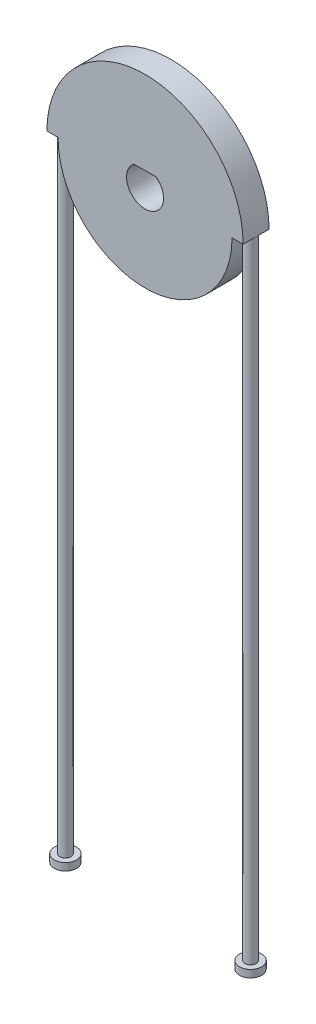
ISO-10303-21;
HEADER;
FILE_DESCRIPTION(('STEP AP214'),'2;1');
FILE_NAME('part.step','',(''),(''),'','','');
FILE_SCHEMA(('AUTOMOTIVE_DESIGN { 1 0 10303 214 1 1 1 1 }'));
ENDSEC;
DATA;
#1=APPLICATION_CONTEXT('core data for automotive mechanical design processes');
#2=APPLICATION_PROTOCOL_DEFINITION('international standard','automotive_design',2000,#1);
#3=PRODUCT_CONTEXT('',#1,'mechanical');
#4=PRODUCT('Part','Part','',(#3));
#5=PRODUCT_RELATED_PRODUCT_CATEGORY('part','',(#4));
#6=PRODUCT_DEFINITION_FORMATION('','',#4);
#7=PRODUCT_DEFINITION_CONTEXT('part definition',#1,'design');
#8=PRODUCT_DEFINITION('design','',#6,#7);
#9=PRODUCT_DEFINITION_SHAPE('','',#8);
#10=(LENGTH_UNIT() NAMED_UNIT(*) SI_UNIT(.MILLI.,.METRE.));
#11=(NAMED_UNIT(*) PLANE_ANGLE_UNIT() SI_UNIT($,.RADIAN.));
#12=(NAMED_UNIT(*) SI_UNIT($,.STERADIAN.) SOLID_ANGLE_UNIT());
#13=UNCERTAINTY_MEASURE_WITH_UNIT(LENGTH_MEASURE(1.E-05),#10,'distance_accuracy_value','');
#14=(GEOMETRIC_REPRESENTATION_CONTEXT(3) GLOBAL_UNCERTAINTY_ASSIGNED_CONTEXT((#13)) GLOBAL_UNIT_ASSIGNED_CONTEXT((#10,
#11,#12)) REPRESENTATION_CONTEXT('',''));
#15=CARTESIAN_POINT('',(0.,0.,0.));
#16=DIRECTION('',(0.,0.,1.));
#17=DIRECTION('',(1.,0.,0.));
#18=AXIS2_PLACEMENT_3D('',#15,#16,#17);
#19=CARTESIAN_POINT('',(-23.5,0.,3.56195922115811));
#20=DIRECTION('',(0.,1.,0.));
#21=DIRECTION('',(0.,0.,1.));
#22=AXIS2_PLACEMENT_3D('',#19,#20,#21);
#23=PLANE('',#22);
#24=CARTESIAN_POINT('',(-25.,0.,0.0619592211581121));
#25=DIRECTION('',(0.,1.,0.));
#26=DIRECTION('',(0.,0.,1.));
#27=AXIS2_PLACEMENT_3D('',#24,#25,#26);
#28=CIRCLE('',#27,1.5);
#29=CARTESIAN_POINT('',(-26.5,0.,0.0619592211581121));
#30=VERTEX_POINT('',#29);
#31=CARTESIAN_POINT('',(-23.5,0.,0.0619592211581121));
#32=VERTEX_POINT('',#31);
#33=EDGE_CURVE('E11',#30,#32,#28,.F.);
#34=ORIENTED_EDGE('',*,*,#33,.F.);
#35=DIRECTION('',(0.,0.,-1.));
#36=VECTOR('',#35,1.);
#37=CARTESIAN_POINT('',(-26.5,0.,3.56195922115811));
#38=LINE('',#37,#36);
#39=CARTESIAN_POINT('',(-26.5,0.,-3.43804077884189));
#40=VERTEX_POINT('',#39);
#41=EDGE_CURVE('E107',#30,#40,#38,.T.);
#42=ORIENTED_EDGE('',*,*,#41,.T.);
#43=DIRECTION('',(1.,0.,0.));
#44=VECTOR('',#43,1.);
#45=CARTESIAN_POINT('',(-23.5,0.,-3.43804077884189));
#46=LINE('',#45,#44);
#47=CARTESIAN_POINT('',(-23.5,0.,-3.43804077884189));
#48=VERTEX_POINT('',#47);
#49=EDGE_CURVE('E135',#40,#48,#46,.T.);
#50=ORIENTED_EDGE('',*,*,#49,.T.);
#51=DIRECTION('',(0.,0.,-1.));
#52=VECTOR('',#51,1.);
#53=CARTESIAN_POINT('',(-23.5,0.,3.56195922115811));
#54=LINE('',#53,#52);
#55=EDGE_CURVE('E106',#32,#48,#54,.T.);
#56=ORIENTED_EDGE('',*,*,#55,.F.);
#57=EDGE_LOOP('',(#34,#42,#50,#56));
#58=FACE_BOUND('',#57,.T.);
#59=ADVANCED_FACE('F35',(#58),#23,.F.);
#60=CARTESIAN_POINT('',(26.5,0.,3.56195922115811));
#61=DIRECTION('',(0.,1.,0.));
#62=DIRECTION('',(0.,0.,1.));
#63=AXIS2_PLACEMENT_3D('',#60,#61,#62);
#64=PLANE('',#63);
#65=CARTESIAN_POINT('',(25.,0.,0.0619592211581125));
#66=DIRECTION('',(0.,-1.,0.));
#67=DIRECTION('',(0.,0.,-1.));
#68=AXIS2_PLACEMENT_3D('',#65,#66,#67);
#69=CIRCLE('',#68,1.5);
#70=CARTESIAN_POINT('',(23.5,0.,0.0619592211581125));
#71=VERTEX_POINT('',#70);
#72=CARTESIAN_POINT('',(26.5,0.,0.0619592211581125));
#73=VERTEX_POINT('',#72);
#74=EDGE_CURVE('E125',#71,#73,#69,.T.);
#75=ORIENTED_EDGE('',*,*,#74,.F.);
#76=DIRECTION('',(0.,0.,-1.));
#77=VECTOR('',#76,1.);
#78=CARTESIAN_POINT('',(23.5,0.,3.56195922115811));
#79=LINE('',#78,#77);
#80=CARTESIAN_POINT('',(23.5,0.,-3.43804077884189));
#81=VERTEX_POINT('',#80);
#82=EDGE_CURVE('E157',#71,#81,#79,.T.);
#83=ORIENTED_EDGE('',*,*,#82,.T.);
#84=DIRECTION('',(1.,0.,0.));
#85=VECTOR('',#84,1.);
#86=CARTESIAN_POINT('',(26.5,0.,-3.43804077884189));
#87=LINE('',#86,#85);
#88=CARTESIAN_POINT('',(26.5,0.,-3.43804077884189));
#89=VERTEX_POINT('',#88);
#90=EDGE_CURVE('E139',#81,#89,#87,.T.);
#91=ORIENTED_EDGE('',*,*,#90,.T.);
#92=DIRECTION('',(0.,0.,-1.));
#93=VECTOR('',#92,1.);
#94=CARTESIAN_POINT('',(26.5,0.,3.56195922115811));
#95=LINE('',#94,#93);
#96=EDGE_CURVE('E154',#73,#89,#95,.T.);
#97=ORIENTED_EDGE('',*,*,#96,.F.);
#98=EDGE_LOOP('',(#75,#83,#91,#97));
#99=FACE_BOUND('',#98,.T.);
#100=ADVANCED_FACE('F182',(#99),#64,.F.);
#101=CARTESIAN_POINT('',(0.,0.,3.56195922115811));
#102=DIRECTION('',(0.,0.,-1.));
#103=DIRECTION('',(-1.,0.,0.));
#104=AXIS2_PLACEMENT_3D('',#101,#102,#103);
#105=PLANE('',#104);
#106=DIRECTION('',(0.999941658436289,0.0108018389028613,0.));
#107=VECTOR('',#106,1.);
#108=CARTESIAN_POINT('',(-0.0432073556114454,3.99976663374516,3.56195922115811));
#109=LINE('',#108,#107);
#110=CARTESIAN_POINT('',(-3.04303233092031,3.96736111703658,3.56195922115811));
#111=VERTEX_POINT('',#110);
#112=CARTESIAN_POINT('',(2.95661761969742,4.03217215045374,3.56195922115811));
#113=VERTEX_POINT('',#112);
#114=EDGE_CURVE('E167',#111,#113,#109,.T.);
#115=ORIENTED_EDGE('',*,*,#114,.T.);
#116=CARTESIAN_POINT('',(0.,0.,3.56195922115811));
#117=DIRECTION('',(0.,0.,-1.));
#118=DIRECTION('',(-1.,0.,0.));
#119=AXIS2_PLACEMENT_3D('',#116,#117,#118);
#120=CIRCLE('',#119,5.);
#121=EDGE_CURVE('E172',#113,#111,#120,.T.);
#122=ORIENTED_EDGE('',*,*,#121,.T.);
#123=EDGE_LOOP('',(#115,#122));
#124=FACE_BOUND('',#123,.T.);
#125=CARTESIAN_POINT('',(0.,0.,3.56195922115811));
#126=DIRECTION('',(0.,0.,1.));
#127=DIRECTION('',(-1.,0.,0.));
#128=AXIS2_PLACEMENT_3D('',#125,#126,#127);
#129=CIRCLE('',#128,23.5);
#130=CARTESIAN_POINT('',(-23.5,0.,3.56195922115811));
#131=VERTEX_POINT('',#130);
#132=CARTESIAN_POINT('',(23.5,0.,3.56195922115811));
#133=VERTEX_POINT('',#132);
#134=EDGE_CURVE('E138',#131,#133,#129,.T.);
#135=ORIENTED_EDGE('',*,*,#134,.T.);
#136=DIRECTION('',(1.,0.,0.));
#137=VECTOR('',#136,1.);
#138=CARTESIAN_POINT('',(26.5,0.,3.56195922115811));
#139=LINE('',#138,#137);
#140=CARTESIAN_POINT('',(26.5,0.,3.56195922115811));
#141=VERTEX_POINT('',#140);
#142=EDGE_CURVE('E117',#133,#141,#139,.T.);
#143=ORIENTED_EDGE('',*,*,#142,.T.);
#144=CARTESIAN_POINT('',(0.,0.,3.56195922115811));
#145=DIRECTION('',(0.,0.,1.));
#146=DIRECTION('',(1.,0.,0.));
#147=AXIS2_PLACEMENT_3D('',#144,#145,#146);
#148=CIRCLE('',#147,26.5);
#149=CARTESIAN_POINT('',(-26.5,0.,3.56195922115811));
#150=VERTEX_POINT('',#149);
#151=EDGE_CURVE('E43',#141,#150,#148,.T.);
#152=ORIENTED_EDGE('',*,*,#151,.T.);
#153=DIRECTION('',(1.,0.,0.));
#154=VECTOR('',#153,1.);
#155=CARTESIAN_POINT('',(-23.5,0.,3.56195922115811));
#156=LINE('',#155,#154);
#157=EDGE_CURVE('E102',#150,#131,#156,.T.);
#158=ORIENTED_EDGE('',*,*,#157,.T.);
#159=EDGE_LOOP('',(#135,#143,#152,#158));
#160=FACE_BOUND('',#159,.T.);
#161=ADVANCED_FACE('F37',(#124,#160),#105,.F.);
#162=CARTESIAN_POINT('',(0.,0.,3.56195922115811));
#163=DIRECTION('',(0.,0.,1.));
#164=DIRECTION('',(1.,0.,0.));
#165=AXIS2_PLACEMENT_3D('',#162,#163,#164);
#166=CYLINDRICAL_SURFACE('',#165,26.5);
#167=ORIENTED_EDGE('',*,*,#151,.F.);
#168=EDGE_CURVE('E150',#141,#73,#95,.T.);
#169=ORIENTED_EDGE('',*,*,#168,.T.);
#170=ORIENTED_EDGE('',*,*,#96,.T.);
#171=CARTESIAN_POINT('',(0.,0.,-3.43804077884189));
#172=DIRECTION('',(0.,0.,1.));
#173=DIRECTION('',(1.,0.,0.));
#174=AXIS2_PLACEMENT_3D('',#171,#172,#173);
#175=CIRCLE('',#174,26.5);
#176=EDGE_CURVE('E113',#89,#40,#175,.T.);
#177=ORIENTED_EDGE('',*,*,#176,.T.);
#178=ORIENTED_EDGE('',*,*,#41,.F.);
#179=EDGE_CURVE('E98',#150,#30,#38,.T.);
#180=ORIENTED_EDGE('',*,*,#179,.F.);
#181=EDGE_LOOP('',(#167,#169,#170,#177,#178,#180));
#182=FACE_BOUND('',#181,.T.);
#183=ADVANCED_FACE('F111',(#182),#166,.T.);
#184=CARTESIAN_POINT('',(0.,0.,-3.43804077884189));
#185=DIRECTION('',(0.,0.,1.));
#186=DIRECTION('',(1.,0.,0.));
#187=AXIS2_PLACEMENT_3D('',#184,#185,#186);
#188=PLANE('',#187);
#189=DIRECTION('',(0.999941658436289,0.0108018389028613,0.));
#190=VECTOR('',#189,1.);
#191=CARTESIAN_POINT('',(2.95661761969742,4.03217215045374,-3.43804077884189));
#192=LINE('',#191,#190);
#193=CARTESIAN_POINT('',(-3.04303233092031,3.96736111703658,-3.43804077884189));
#194=VERTEX_POINT('',#193);
#195=CARTESIAN_POINT('',(2.95661761969742,4.03217215045374,-3.43804077884189));
#196=VERTEX_POINT('',#195);
#197=EDGE_CURVE('E161',#194,#196,#192,.T.);
#198=ORIENTED_EDGE('',*,*,#197,.F.);
#199=CARTESIAN_POINT('',(0.,0.,-3.43804077884189));
#200=DIRECTION('',(0.,0.,-1.));
#201=DIRECTION('',(-1.,0.,0.));
#202=AXIS2_PLACEMENT_3D('',#199,#200,#201);
#203=CIRCLE('',#202,5.);
#204=EDGE_CURVE('E153',#196,#194,#203,.T.);
#205=ORIENTED_EDGE('',*,*,#204,.F.);
#206=EDGE_LOOP('',(#198,#205));
#207=FACE_BOUND('',#206,.T.);
#208=ORIENTED_EDGE('',*,*,#176,.F.);
#209=ORIENTED_EDGE('',*,*,#90,.F.);
#210=CARTESIAN_POINT('',(0.,0.,-3.43804077884189));
#211=DIRECTION('',(0.,0.,1.));
#212=DIRECTION('',(-1.,0.,0.));
#213=AXIS2_PLACEMENT_3D('',#210,#211,#212);
#214=CIRCLE('',#213,23.5);
#215=EDGE_CURVE('E145',#48,#81,#214,.T.);
#216=ORIENTED_EDGE('',*,*,#215,.F.);
#217=ORIENTED_EDGE('',*,*,#49,.F.);
#218=EDGE_LOOP('',(#208,#209,#216,#217));
#219=FACE_BOUND('',#218,.T.);
#220=ADVANCED_FACE('F187',(#207,#219),#188,.F.);
#221=CARTESIAN_POINT('',(0.,0.,5.56195922115811));
#222=DIRECTION('',(0.,0.,-1.));
#223=DIRECTION('',(-1.,0.,0.));
#224=AXIS2_PLACEMENT_3D('',#221,#222,#223);
#225=CYLINDRICAL_SURFACE('',#224,5.);
#226=DIRECTION('',(0.,0.,-1.));
#227=VECTOR('',#226,1.);
#228=CARTESIAN_POINT('',(2.95661761969742,4.03217215045374,5.56195922115811));
#229=LINE('',#228,#227);
#230=EDGE_CURVE('E165',#113,#196,#229,.T.);
#231=ORIENTED_EDGE('',*,*,#230,.T.);
#232=ORIENTED_EDGE('',*,*,#204,.T.);
#233=DIRECTION('',(0.,0.,-1.));
#234=VECTOR('',#233,1.);
#235=CARTESIAN_POINT('',(-3.04303233092031,3.96736111703658,5.56195922115811));
#236=LINE('',#235,#234);
#237=EDGE_CURVE('E164',#111,#194,#236,.T.);
#238=ORIENTED_EDGE('',*,*,#237,.F.);
#239=ORIENTED_EDGE('',*,*,#121,.F.);
#240=EDGE_LOOP('',(#231,#232,#238,#239));
#241=FACE_BOUND('',#240,.T.);
#242=ADVANCED_FACE('F200',(#241),#225,.F.);
#243=CARTESIAN_POINT('',(2.95661761969742,4.03217215045374,5.56195922115811));
#244=DIRECTION('',(-0.0108018389028613,0.999941658436289,0.));
#245=DIRECTION('',(-0.999941658436289,-0.0108018389028613,0.));
#246=AXIS2_PLACEMENT_3D('',#243,#244,#245);
#247=PLANE('',#246);
#248=ORIENTED_EDGE('',*,*,#237,.T.);
#249=ORIENTED_EDGE('',*,*,#197,.T.);
#250=ORIENTED_EDGE('',*,*,#230,.F.);
#251=ORIENTED_EDGE('',*,*,#114,.F.);
#252=EDGE_LOOP('',(#248,#249,#250,#251));
#253=FACE_BOUND('',#252,.T.);
#254=ADVANCED_FACE('F193',(#253),#247,.F.);
#255=EDGE_CURVE('E58',#73,#71,#69,.T.);
#256=ORIENTED_EDGE('',*,*,#255,.F.);
#257=ORIENTED_EDGE('',*,*,#168,.F.);
#258=ORIENTED_EDGE('',*,*,#142,.F.);
#259=EDGE_CURVE('E155',#133,#71,#79,.T.);
#260=ORIENTED_EDGE('',*,*,#259,.T.);
#261=EDGE_LOOP('',(#256,#257,#258,#260));
#262=FACE_BOUND('',#261,.T.);
#263=ADVANCED_FACE('F191',(#262),#64,.F.);
#264=CARTESIAN_POINT('',(0.,0.,3.56195922115811));
#265=DIRECTION('',(0.,0.,-1.));
#266=DIRECTION('',(-1.,0.,0.));
#267=AXIS2_PLACEMENT_3D('',#264,#265,#266);
#268=CYLINDRICAL_SURFACE('',#267,23.5);
#269=ORIENTED_EDGE('',*,*,#215,.T.);
#270=ORIENTED_EDGE('',*,*,#82,.F.);
#271=ORIENTED_EDGE('',*,*,#259,.F.);
#272=ORIENTED_EDGE('',*,*,#134,.F.);
#273=EDGE_CURVE('E158',#131,#32,#54,.T.);
#274=ORIENTED_EDGE('',*,*,#273,.T.);
#275=ORIENTED_EDGE('',*,*,#55,.T.);
#276=EDGE_LOOP('',(#269,#270,#271,#272,#274,#275));
#277=FACE_BOUND('',#276,.T.);
#278=ADVANCED_FACE('F189',(#277),#268,.T.);
#279=CARTESIAN_POINT('',(-25.,0.,0.0619592211581121));
#280=DIRECTION('',(0.,-1.,0.));
#281=DIRECTION('',(0.,0.,-1.));
#282=AXIS2_PLACEMENT_3D('',#279,#280,#281);
#283=CIRCLE('',#282,1.5);
#284=EDGE_CURVE('E50',#32,#30,#283,.T.);
#285=ORIENTED_EDGE('',*,*,#284,.F.);
#286=ORIENTED_EDGE('',*,*,#273,.F.);
#287=ORIENTED_EDGE('',*,*,#157,.F.);
#288=ORIENTED_EDGE('',*,*,#179,.T.);
#289=EDGE_LOOP('',(#285,#286,#287,#288));
#290=FACE_BOUND('',#289,.T.);
#291=ADVANCED_FACE('F100',(#290),#23,.F.);
#292=CARTESIAN_POINT('',(25.,-170.,0.0619592211581125));
#293=DIRECTION('',(0.,1.,0.));
#294=DIRECTION('',(0.,0.,1.));
#295=AXIS2_PLACEMENT_3D('',#292,#293,#294);
#296=CYLINDRICAL_SURFACE('',#295,1.5);
#297=CARTESIAN_POINT('',(25.,-170.,0.0619592211581125));
#298=DIRECTION('',(0.,-1.,0.));
#299=DIRECTION('',(0.,0.,-1.));
#300=AXIS2_PLACEMENT_3D('',#297,#298,#299);
#301=CIRCLE('',#300,1.5);
#302=CARTESIAN_POINT('',(25.,-170.,-1.43804077884189));
#303=VERTEX_POINT('',#302);
#304=EDGE_CURVE('E132',#303,#303,#301,.T.);
#305=ORIENTED_EDGE('',*,*,#304,.F.);
#306=EDGE_LOOP('',(#305));
#307=FACE_BOUND('',#306,.T.);
#308=ORIENTED_EDGE('',*,*,#255,.T.);
#309=ORIENTED_EDGE('',*,*,#74,.T.);
#310=EDGE_LOOP('',(#308,#309));
#311=FACE_BOUND('',#310,.T.);
#312=ADVANCED_FACE('F180',(#307,#311),#296,.T.);
#313=CARTESIAN_POINT('',(-25.,-170.,0.0619592211581121));
#314=DIRECTION('',(0.,1.,0.));
#315=DIRECTION('',(0.,0.,1.));
#316=AXIS2_PLACEMENT_3D('',#313,#314,#315);
#317=CYLINDRICAL_SURFACE('',#316,1.5);
#318=CARTESIAN_POINT('',(-25.,-170.,0.0619592211581121));
#319=DIRECTION('',(0.,-1.,0.));
#320=DIRECTION('',(0.,0.,-1.));
#321=AXIS2_PLACEMENT_3D('',#318,#319,#320);
#322=CIRCLE('',#321,1.5);
#323=CARTESIAN_POINT('',(-25.,-170.,-1.43804077884189));
#324=VERTEX_POINT('',#323);
#325=EDGE_CURVE('E121',#324,#324,#322,.T.);
#326=ORIENTED_EDGE('',*,*,#325,.F.);
#327=EDGE_LOOP('',(#326));
#328=FACE_BOUND('',#327,.T.);
#329=ORIENTED_EDGE('',*,*,#284,.T.);
#330=ORIENTED_EDGE('',*,*,#33,.T.);
#331=EDGE_LOOP('',(#329,#330));
#332=FACE_BOUND('',#331,.T.);
#333=ADVANCED_FACE('F120',(#328,#332),#317,.T.);
#334=CARTESIAN_POINT('',(25.,-172.,0.0619592211581125));
#335=DIRECTION('',(0.,1.,0.));
#336=DIRECTION('',(0.,0.,1.));
#337=AXIS2_PLACEMENT_3D('',#334,#335,#336);
#338=CYLINDRICAL_SURFACE('',#337,3.);
#339=CARTESIAN_POINT('',(25.,-172.,0.0619592211581125));
#340=DIRECTION('',(0.,-1.,0.));
#341=DIRECTION('',(0.,0.,-1.));
#342=AXIS2_PLACEMENT_3D('',#339,#340,#341);
#343=CIRCLE('',#342,3.);
#344=CARTESIAN_POINT('',(25.,-172.,-2.93804077884189));
#345=VERTEX_POINT('',#344);
#346=EDGE_CURVE('E122',#345,#345,#343,.T.);
#347=ORIENTED_EDGE('',*,*,#346,.F.);
#348=EDGE_LOOP('',(#347));
#349=FACE_BOUND('',#348,.T.);
#350=CARTESIAN_POINT('',(25.,-170.,0.0619592211581125));
#351=DIRECTION('',(0.,-1.,0.));
#352=DIRECTION('',(0.,0.,-1.));
#353=AXIS2_PLACEMENT_3D('',#350,#351,#352);
#354=CIRCLE('',#353,3.);
#355=CARTESIAN_POINT('',(25.,-170.,-2.93804077884189));
#356=VERTEX_POINT('',#355);
#357=EDGE_CURVE('E128',#356,#356,#354,.T.);
#358=ORIENTED_EDGE('',*,*,#357,.T.);
#359=EDGE_LOOP('',(#358));
#360=FACE_BOUND('',#359,.T.);
#361=ADVANCED_FACE('F217',(#349,#360),#338,.T.);
#362=CARTESIAN_POINT('',(25.,-172.,0.0619592211581125));
#363=DIRECTION('',(0.,-1.,0.));
#364=DIRECTION('',(0.,0.,-1.));
#365=AXIS2_PLACEMENT_3D('',#362,#363,#364);
#366=PLANE('',#365);
#367=ORIENTED_EDGE('',*,*,#346,.T.);
#368=EDGE_LOOP('',(#367));
#369=FACE_BOUND('',#368,.T.);
#370=ADVANCED_FACE('F224',(#369),#366,.T.);
#371=CARTESIAN_POINT('',(25.,-170.,0.0619592211581125));
#372=DIRECTION('',(0.,-1.,0.));
#373=DIRECTION('',(0.,0.,-1.));
#374=AXIS2_PLACEMENT_3D('',#371,#372,#373);
#375=PLANE('',#374);
#376=ORIENTED_EDGE('',*,*,#304,.T.);
#377=EDGE_LOOP('',(#376));
#378=FACE_BOUND('',#377,.T.);
#379=ORIENTED_EDGE('',*,*,#357,.F.);
#380=EDGE_LOOP('',(#379));
#381=FACE_BOUND('',#380,.T.);
#382=ADVANCED_FACE('F226',(#378,#381),#375,.F.);
#383=CARTESIAN_POINT('',(-25.,-172.,0.0619592211581121));
#384=DIRECTION('',(0.,1.,0.));
#385=DIRECTION('',(0.,0.,1.));
#386=AXIS2_PLACEMENT_3D('',#383,#384,#385);
#387=CYLINDRICAL_SURFACE('',#386,3.);
#388=CARTESIAN_POINT('',(-25.,-172.,0.0619592211581121));
#389=DIRECTION('',(0.,-1.,0.));
#390=DIRECTION('',(0.,0.,-1.));
#391=AXIS2_PLACEMENT_3D('',#388,#389,#390);
#392=CIRCLE('',#391,3.);
#393=CARTESIAN_POINT('',(-25.,-172.,-2.93804077884189));
#394=VERTEX_POINT('',#393);
#395=EDGE_CURVE('E248',#394,#394,#392,.T.);
#396=ORIENTED_EDGE('',*,*,#395,.F.);
#397=EDGE_LOOP('',(#396));
#398=FACE_BOUND('',#397,.T.);
#399=CARTESIAN_POINT('',(-25.,-170.,0.0619592211581121));
#400=DIRECTION('',(0.,-1.,0.));
#401=DIRECTION('',(0.,0.,-1.));
#402=AXIS2_PLACEMENT_3D('',#399,#400,#401);
#403=CIRCLE('',#402,3.);
#404=CARTESIAN_POINT('',(-25.,-170.,-2.93804077884189));
#405=VERTEX_POINT('',#404);
#406=EDGE_CURVE('E249',#405,#405,#403,.T.);
#407=ORIENTED_EDGE('',*,*,#406,.T.);
#408=EDGE_LOOP('',(#407));
#409=FACE_BOUND('',#408,.T.);
#410=ADVANCED_FACE('F229',(#398,#409),#387,.T.);
#411=CARTESIAN_POINT('',(-25.,-172.,0.0619592211581121));
#412=DIRECTION('',(0.,-1.,0.));
#413=DIRECTION('',(0.,0.,-1.));
#414=AXIS2_PLACEMENT_3D('',#411,#412,#413);
#415=PLANE('',#414);
#416=ORIENTED_EDGE('',*,*,#395,.T.);
#417=EDGE_LOOP('',(#416));
#418=FACE_BOUND('',#417,.T.);
#419=ADVANCED_FACE('F236',(#418),#415,.T.);
#420=CARTESIAN_POINT('',(-25.,-170.,0.0619592211581121));
#421=DIRECTION('',(0.,-1.,0.));
#422=DIRECTION('',(0.,0.,-1.));
#423=AXIS2_PLACEMENT_3D('',#420,#421,#422);
#424=PLANE('',#423);
#425=ORIENTED_EDGE('',*,*,#325,.T.);
#426=EDGE_LOOP('',(#425));
#427=FACE_BOUND('',#426,.T.);
#428=ORIENTED_EDGE('',*,*,#406,.F.);
#429=EDGE_LOOP('',(#428));
#430=FACE_BOUND('',#429,.T.);
#431=ADVANCED_FACE('F238',(#427,#430),#424,.F.);
#432=CLOSED_SHELL('',(#59,#100,#161,#183,#220,#242,#254,#263,#278,#291,#312,#333,#361,#370,#382,
#410,#419,#431));
#433=MANIFOLD_SOLID_BREP('B2',#432);
#434=ADVANCED_BREP_SHAPE_REPRESENTATION('',(#18,#433),#14);
#435=SHAPE_DEFINITION_REPRESENTATION(#9,#434);
ENDSEC;
END-ISO-10303-21;
